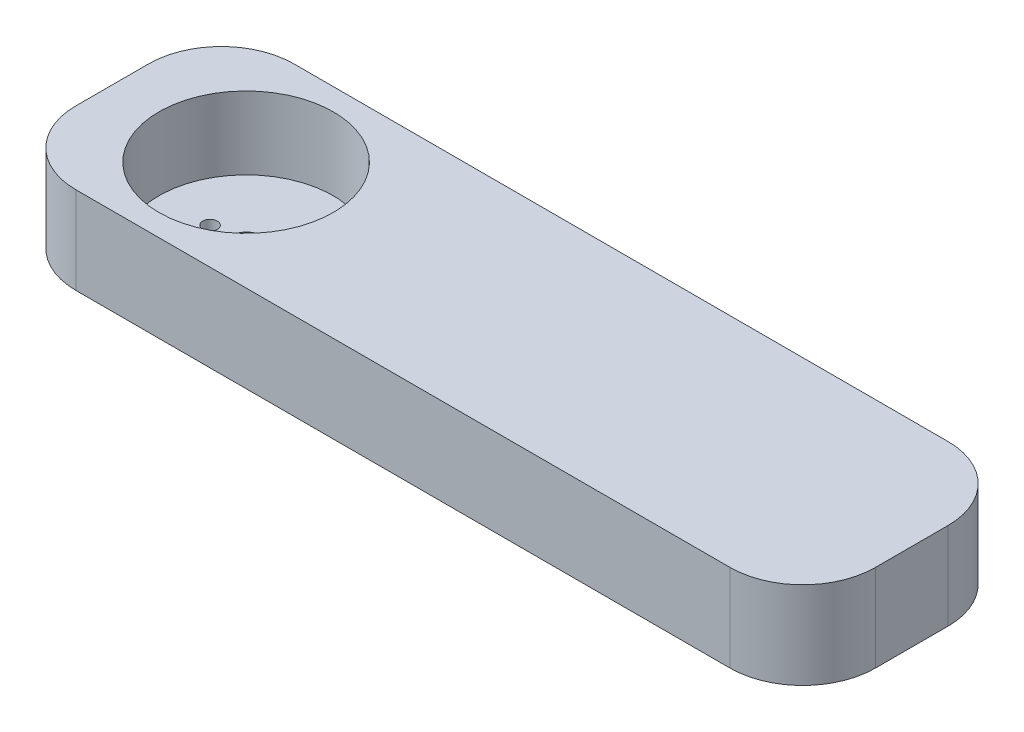
ISO-10303-21;
HEADER;
FILE_DESCRIPTION(('STEP AP214'),'2;1');
FILE_NAME('part.step','',(''),(''),'','','');
FILE_SCHEMA(('AUTOMOTIVE_DESIGN { 1 0 10303 214 1 1 1 1 }'));
ENDSEC;
DATA;
#1=APPLICATION_CONTEXT('core data for automotive mechanical design processes');
#2=APPLICATION_PROTOCOL_DEFINITION('international standard','automotive_design',2000,#1);
#3=PRODUCT_CONTEXT('',#1,'mechanical');
#4=PRODUCT('Part','Part','',(#3));
#5=PRODUCT_RELATED_PRODUCT_CATEGORY('part','',(#4));
#6=PRODUCT_DEFINITION_FORMATION('','',#4);
#7=PRODUCT_DEFINITION_CONTEXT('part definition',#1,'design');
#8=PRODUCT_DEFINITION('design','',#6,#7);
#9=PRODUCT_DEFINITION_SHAPE('','',#8);
#10=(LENGTH_UNIT() NAMED_UNIT(*) SI_UNIT(.MILLI.,.METRE.));
#11=(NAMED_UNIT(*) PLANE_ANGLE_UNIT() SI_UNIT($,.RADIAN.));
#12=(NAMED_UNIT(*) SI_UNIT($,.STERADIAN.) SOLID_ANGLE_UNIT());
#13=UNCERTAINTY_MEASURE_WITH_UNIT(LENGTH_MEASURE(1.E-05),#10,'distance_accuracy_value','');
#14=(GEOMETRIC_REPRESENTATION_CONTEXT(3) GLOBAL_UNCERTAINTY_ASSIGNED_CONTEXT((#13)) GLOBAL_UNIT_ASSIGNED_CONTEXT((#10,
#11,#12)) REPRESENTATION_CONTEXT('',''));
#15=CARTESIAN_POINT('',(0.,0.,0.));
#16=DIRECTION('',(0.,0.,1.));
#17=DIRECTION('',(1.,0.,0.));
#18=AXIS2_PLACEMENT_3D('',#15,#16,#17);
#19=CARTESIAN_POINT('',(-49.6145692439427,12.,-18.5383745295534));
#20=DIRECTION('',(1.,0.,0.));
#21=DIRECTION('',(0.,0.,-1.));
#22=AXIS2_PLACEMENT_3D('',#19,#20,#21);
#23=PLANE('',#22);
#24=DIRECTION('',(0.,0.,1.));
#25=VECTOR('',#24,1.);
#26=CARTESIAN_POINT('',(-49.6145692439427,12.,-18.5383745295534));
#27=LINE('',#26,#25);
#28=CARTESIAN_POINT('',(-49.6145692439427,12.,-8.53837452955342));
#29=VERTEX_POINT('',#28);
#30=CARTESIAN_POINT('',(-49.6145692439427,12.,1.46162547044658));
#31=VERTEX_POINT('',#30);
#32=EDGE_CURVE('E119',#29,#31,#27,.T.);
#33=ORIENTED_EDGE('',*,*,#32,.F.);
#34=DIRECTION('',(0.,-1.,0.));
#35=VECTOR('',#34,1.);
#36=CARTESIAN_POINT('',(-49.6145692439427,12.,-8.53837452955342));
#37=LINE('',#36,#35);
#38=CARTESIAN_POINT('',(-49.6145692439427,0.,-8.53837452955342));
#39=VERTEX_POINT('',#38);
#40=EDGE_CURVE('E105',#29,#39,#37,.T.);
#41=ORIENTED_EDGE('',*,*,#40,.T.);
#42=DIRECTION('',(0.,0.,1.));
#43=VECTOR('',#42,1.);
#44=CARTESIAN_POINT('',(-49.6145692439427,0.,-18.5383745295534));
#45=LINE('',#44,#43);
#46=CARTESIAN_POINT('',(-49.6145692439427,0.,1.46162547044658));
#47=VERTEX_POINT('',#46);
#48=EDGE_CURVE('E116',#39,#47,#45,.T.);
#49=ORIENTED_EDGE('',*,*,#48,.T.);
#50=DIRECTION('',(0.,-1.,0.));
#51=VECTOR('',#50,1.);
#52=CARTESIAN_POINT('',(-49.6145692439427,12.,1.46162547044658));
#53=LINE('',#52,#51);
#54=EDGE_CURVE('E120',#47,#31,#53,.F.);
#55=ORIENTED_EDGE('',*,*,#54,.T.);
#56=EDGE_LOOP('',(#33,#41,#49,#55));
#57=FACE_BOUND('',#56,.T.);
#58=ADVANCED_FACE('F33',(#57),#23,.F.);
#59=CARTESIAN_POINT('',(-49.6145692439427,12.,11.4616254704466));
#60=DIRECTION('',(0.,0.,-1.));
#61=DIRECTION('',(-1.,0.,0.));
#62=AXIS2_PLACEMENT_3D('',#59,#60,#61);
#63=PLANE('',#62);
#64=DIRECTION('',(1.,0.,0.));
#65=VECTOR('',#64,1.);
#66=CARTESIAN_POINT('',(-49.6145692439427,0.,11.4616254704466));
#67=LINE('',#66,#65);
#68=CARTESIAN_POINT('',(-39.6145692439427,0.,11.4616254704466));
#69=VERTEX_POINT('',#68);
#70=CARTESIAN_POINT('',(50.3854307560573,0.,11.4616254704466));
#71=VERTEX_POINT('',#70);
#72=EDGE_CURVE('E124',#69,#71,#67,.T.);
#73=ORIENTED_EDGE('',*,*,#72,.T.);
#74=DIRECTION('',(0.,-1.,0.));
#75=VECTOR('',#74,1.);
#76=CARTESIAN_POINT('',(50.3854307560573,12.,11.4616254704466));
#77=LINE('',#76,#75);
#78=CARTESIAN_POINT('',(50.3854307560573,12.,11.4616254704466));
#79=VERTEX_POINT('',#78);
#80=EDGE_CURVE('E11',#71,#79,#77,.F.);
#81=ORIENTED_EDGE('',*,*,#80,.T.);
#82=DIRECTION('',(1.,0.,0.));
#83=VECTOR('',#82,1.);
#84=CARTESIAN_POINT('',(-49.6145692439427,12.,11.4616254704466));
#85=LINE('',#84,#83);
#86=CARTESIAN_POINT('',(-39.6145692439427,12.,11.4616254704466));
#87=VERTEX_POINT('',#86);
#88=EDGE_CURVE('E178',#87,#79,#85,.T.);
#89=ORIENTED_EDGE('',*,*,#88,.F.);
#90=DIRECTION('',(0.,-1.,0.));
#91=VECTOR('',#90,1.);
#92=CARTESIAN_POINT('',(-39.6145692439427,12.,11.4616254704466));
#93=LINE('',#92,#91);
#94=EDGE_CURVE('E146',#87,#69,#93,.T.);
#95=ORIENTED_EDGE('',*,*,#94,.T.);
#96=EDGE_LOOP('',(#73,#81,#89,#95));
#97=FACE_BOUND('',#96,.T.);
#98=ADVANCED_FACE('F176',(#97),#63,.F.);
#99=CARTESIAN_POINT('',(60.3854307560573,12.,-18.5383745295534));
#100=DIRECTION('',(-1.,0.,0.));
#101=DIRECTION('',(0.,0.,1.));
#102=AXIS2_PLACEMENT_3D('',#99,#100,#101);
#103=PLANE('',#102);
#104=DIRECTION('',(0.,0.,-1.));
#105=VECTOR('',#104,1.);
#106=CARTESIAN_POINT('',(60.3854307560573,0.,-18.5383745295534));
#107=LINE('',#106,#105);
#108=CARTESIAN_POINT('',(60.3854307560573,0.,1.46162547044659));
#109=VERTEX_POINT('',#108);
#110=CARTESIAN_POINT('',(60.3854307560573,0.,-8.53837452955341));
#111=VERTEX_POINT('',#110);
#112=EDGE_CURVE('E127',#109,#111,#107,.T.);
#113=ORIENTED_EDGE('',*,*,#112,.T.);
#114=DIRECTION('',(0.,-1.,0.));
#115=VECTOR('',#114,1.);
#116=CARTESIAN_POINT('',(60.3854307560573,12.,-8.53837452955341));
#117=LINE('',#116,#115);
#118=CARTESIAN_POINT('',(60.3854307560573,12.,-8.53837452955341));
#119=VERTEX_POINT('',#118);
#120=EDGE_CURVE('E54',#111,#119,#117,.F.);
#121=ORIENTED_EDGE('',*,*,#120,.T.);
#122=DIRECTION('',(0.,0.,-1.));
#123=VECTOR('',#122,1.);
#124=CARTESIAN_POINT('',(60.3854307560573,12.,-18.5383745295534));
#125=LINE('',#124,#123);
#126=CARTESIAN_POINT('',(60.3854307560573,12.,1.46162547044659));
#127=VERTEX_POINT('',#126);
#128=EDGE_CURVE('E165',#127,#119,#125,.T.);
#129=ORIENTED_EDGE('',*,*,#128,.F.);
#130=DIRECTION('',(0.,-1.,0.));
#131=VECTOR('',#130,1.);
#132=CARTESIAN_POINT('',(60.3854307560573,12.,1.46162547044659));
#133=LINE('',#132,#131);
#134=EDGE_CURVE('E156',#127,#109,#133,.T.);
#135=ORIENTED_EDGE('',*,*,#134,.T.);
#136=EDGE_LOOP('',(#113,#121,#129,#135));
#137=FACE_BOUND('',#136,.T.);
#138=ADVANCED_FACE('F172',(#137),#103,.F.);
#139=CARTESIAN_POINT('',(-49.6145692439427,12.,-18.5383745295534));
#140=DIRECTION('',(0.,0.,1.));
#141=DIRECTION('',(1.,0.,0.));
#142=AXIS2_PLACEMENT_3D('',#139,#140,#141);
#143=PLANE('',#142);
#144=DIRECTION('',(-1.,0.,0.));
#145=VECTOR('',#144,1.);
#146=CARTESIAN_POINT('',(-49.6145692439427,12.,-18.5383745295534));
#147=LINE('',#146,#145);
#148=CARTESIAN_POINT('',(50.3854307560573,12.,-18.5383745295534));
#149=VERTEX_POINT('',#148);
#150=CARTESIAN_POINT('',(-39.6145692439427,12.,-18.5383745295534));
#151=VERTEX_POINT('',#150);
#152=EDGE_CURVE('E133',#149,#151,#147,.T.);
#153=ORIENTED_EDGE('',*,*,#152,.F.);
#154=DIRECTION('',(0.,-1.,0.));
#155=VECTOR('',#154,1.);
#156=CARTESIAN_POINT('',(50.3854307560573,12.,-18.5383745295534));
#157=LINE('',#156,#155);
#158=CARTESIAN_POINT('',(50.3854307560573,0.,-18.5383745295534));
#159=VERTEX_POINT('',#158);
#160=EDGE_CURVE('E149',#149,#159,#157,.T.);
#161=ORIENTED_EDGE('',*,*,#160,.T.);
#162=DIRECTION('',(-1.,0.,0.));
#163=VECTOR('',#162,1.);
#164=CARTESIAN_POINT('',(-49.6145692439427,0.,-18.5383745295534));
#165=LINE('',#164,#163);
#166=CARTESIAN_POINT('',(-39.6145692439427,0.,-18.5383745295534));
#167=VERTEX_POINT('',#166);
#168=EDGE_CURVE('E137',#159,#167,#165,.T.);
#169=ORIENTED_EDGE('',*,*,#168,.T.);
#170=DIRECTION('',(0.,-1.,0.));
#171=VECTOR('',#170,1.);
#172=CARTESIAN_POINT('',(-39.6145692439427,12.,-18.5383745295534));
#173=LINE('',#172,#171);
#174=EDGE_CURVE('E107',#167,#151,#173,.F.);
#175=ORIENTED_EDGE('',*,*,#174,.T.);
#176=EDGE_LOOP('',(#153,#161,#169,#175));
#177=FACE_BOUND('',#176,.T.);
#178=ADVANCED_FACE('F169',(#177),#143,.F.);
#179=CARTESIAN_POINT('',(0.,12.,0.));
#180=DIRECTION('',(0.,1.,0.));
#181=DIRECTION('',(0.,0.,1.));
#182=AXIS2_PLACEMENT_3D('',#179,#180,#181);
#183=PLANE('',#182);
#184=CARTESIAN_POINT('',(-31.1957624230947,12.,-3.53837452955342));
#185=DIRECTION('',(0.,1.,0.));
#186=DIRECTION('',(0.,0.,1.));
#187=AXIS2_PLACEMENT_3D('',#184,#185,#186);
#188=CIRCLE('',#187,12.);
#189=CARTESIAN_POINT('',(-31.1957624230947,12.,8.46162547044659));
#190=VERTEX_POINT('',#189);
#191=EDGE_CURVE('E130',#190,#190,#188,.T.);
#192=ORIENTED_EDGE('',*,*,#191,.F.);
#193=EDGE_LOOP('',(#192));
#194=FACE_BOUND('',#193,.T.);
#195=ORIENTED_EDGE('',*,*,#128,.T.);
#196=CARTESIAN_POINT('',(50.3854307560573,12.,-8.53837452955342));
#197=DIRECTION('',(0.,1.,0.));
#198=DIRECTION('',(0.,0.,1.));
#199=AXIS2_PLACEMENT_3D('',#196,#197,#198);
#200=CIRCLE('',#199,10.);
#201=EDGE_CURVE('E41',#119,#149,#200,.T.);
#202=ORIENTED_EDGE('',*,*,#201,.T.);
#203=ORIENTED_EDGE('',*,*,#152,.T.);
#204=CARTESIAN_POINT('',(-39.6145692439427,12.,-8.53837452955342));
#205=DIRECTION('',(0.,1.,0.));
#206=DIRECTION('',(0.,0.,1.));
#207=AXIS2_PLACEMENT_3D('',#204,#205,#206);
#208=CIRCLE('',#207,10.);
#209=EDGE_CURVE('E144',#151,#29,#208,.T.);
#210=ORIENTED_EDGE('',*,*,#209,.T.);
#211=ORIENTED_EDGE('',*,*,#32,.T.);
#212=CARTESIAN_POINT('',(-39.6145692439427,12.,1.46162547044658));
#213=DIRECTION('',(0.,1.,0.));
#214=DIRECTION('',(0.,0.,1.));
#215=AXIS2_PLACEMENT_3D('',#212,#213,#214);
#216=CIRCLE('',#215,10.);
#217=EDGE_CURVE('E142',#31,#87,#216,.T.);
#218=ORIENTED_EDGE('',*,*,#217,.T.);
#219=ORIENTED_EDGE('',*,*,#88,.T.);
#220=CARTESIAN_POINT('',(50.3854307560573,12.,1.46162547044659));
#221=DIRECTION('',(0.,1.,0.));
#222=DIRECTION('',(0.,0.,1.));
#223=AXIS2_PLACEMENT_3D('',#220,#221,#222);
#224=CIRCLE('',#223,10.);
#225=EDGE_CURVE('E160',#79,#127,#224,.T.);
#226=ORIENTED_EDGE('',*,*,#225,.T.);
#227=EDGE_LOOP('',(#195,#202,#203,#210,#211,#218,#219,#226));
#228=FACE_BOUND('',#227,.T.);
#229=ADVANCED_FACE('F164',(#194,#228),#183,.T.);
#230=CARTESIAN_POINT('',(0.,0.,0.));
#231=DIRECTION('',(0.,1.,0.));
#232=DIRECTION('',(0.,0.,1.));
#233=AXIS2_PLACEMENT_3D('',#230,#231,#232);
#234=PLANE('',#233);
#235=CARTESIAN_POINT('',(-36.1635501370406,0.,-3.53837452955341));
#236=DIRECTION('',(0.,1.,0.));
#237=DIRECTION('',(0.,0.,-1.));
#238=AXIS2_PLACEMENT_3D('',#235,#236,#237);
#239=CIRCLE('',#238,0.999999999999998);
#240=CARTESIAN_POINT('',(-36.1635501370406,0.,-4.53837452955341));
#241=VERTEX_POINT('',#240);
#242=EDGE_CURVE('E197',#241,#241,#239,.T.);
#243=ORIENTED_EDGE('',*,*,#242,.T.);
#244=EDGE_LOOP('',(#243));
#245=FACE_BOUND('',#244,.T.);
#246=CARTESIAN_POINT('',(-26.1317928261841,0.,-3.53837452955341));
#247=DIRECTION('',(0.,1.,0.));
#248=DIRECTION('',(0.,0.,1.));
#249=AXIS2_PLACEMENT_3D('',#246,#247,#248);
#250=CIRCLE('',#249,0.999999999999998);
#251=CARTESIAN_POINT('',(-26.1317928261841,0.,-2.53837452955341));
#252=VERTEX_POINT('',#251);
#253=EDGE_CURVE('E191',#252,#252,#250,.T.);
#254=ORIENTED_EDGE('',*,*,#253,.T.);
#255=EDGE_LOOP('',(#254));
#256=FACE_BOUND('',#255,.T.);
#257=CARTESIAN_POINT('',(-31.1476714816123,0.,-3.53837452955341));
#258=DIRECTION('',(0.,1.,0.));
#259=DIRECTION('',(0.,0.,1.));
#260=AXIS2_PLACEMENT_3D('',#257,#258,#259);
#261=CIRCLE('',#260,2.4);
#262=CARTESIAN_POINT('',(-31.1476714816123,0.,-1.13837452955341));
#263=VERTEX_POINT('',#262);
#264=EDGE_CURVE('E186',#263,#263,#261,.T.);
#265=ORIENTED_EDGE('',*,*,#264,.T.);
#266=EDGE_LOOP('',(#265));
#267=FACE_BOUND('',#266,.T.);
#268=ORIENTED_EDGE('',*,*,#168,.F.);
#269=CARTESIAN_POINT('',(50.3854307560573,0.,-8.53837452955342));
#270=DIRECTION('',(0.,1.,0.));
#271=DIRECTION('',(0.,0.,1.));
#272=AXIS2_PLACEMENT_3D('',#269,#270,#271);
#273=CIRCLE('',#272,10.);
#274=EDGE_CURVE('E154',#159,#111,#273,.F.);
#275=ORIENTED_EDGE('',*,*,#274,.T.);
#276=ORIENTED_EDGE('',*,*,#112,.F.);
#277=CARTESIAN_POINT('',(50.3854307560573,0.,1.46162547044659));
#278=DIRECTION('',(0.,1.,0.));
#279=DIRECTION('',(0.,0.,1.));
#280=AXIS2_PLACEMENT_3D('',#277,#278,#279);
#281=CIRCLE('',#280,10.);
#282=EDGE_CURVE('E152',#109,#71,#281,.F.);
#283=ORIENTED_EDGE('',*,*,#282,.T.);
#284=ORIENTED_EDGE('',*,*,#72,.F.);
#285=CARTESIAN_POINT('',(-39.6145692439427,0.,1.46162547044658));
#286=DIRECTION('',(0.,1.,0.));
#287=DIRECTION('',(0.,0.,1.));
#288=AXIS2_PLACEMENT_3D('',#285,#286,#287);
#289=CIRCLE('',#288,10.);
#290=EDGE_CURVE('E111',#69,#47,#289,.F.);
#291=ORIENTED_EDGE('',*,*,#290,.T.);
#292=ORIENTED_EDGE('',*,*,#48,.F.);
#293=CARTESIAN_POINT('',(-39.6145692439427,0.,-8.53837452955342));
#294=DIRECTION('',(0.,1.,0.));
#295=DIRECTION('',(0.,0.,1.));
#296=AXIS2_PLACEMENT_3D('',#293,#294,#295);
#297=CIRCLE('',#296,10.);
#298=EDGE_CURVE('E101',#39,#167,#297,.F.);
#299=ORIENTED_EDGE('',*,*,#298,.T.);
#300=EDGE_LOOP('',(#268,#275,#276,#283,#284,#291,#292,#299));
#301=FACE_BOUND('',#300,.T.);
#302=ADVANCED_FACE('F122',(#245,#256,#267,#301),#234,.F.);
#303=CARTESIAN_POINT('',(-39.6145692439427,12.,-8.53837452955342));
#304=DIRECTION('',(0.,-1.,0.));
#305=DIRECTION('',(0.,0.,-1.));
#306=AXIS2_PLACEMENT_3D('',#303,#304,#305);
#307=CYLINDRICAL_SURFACE('',#306,10.);
#308=ORIENTED_EDGE('',*,*,#209,.F.);
#309=ORIENTED_EDGE('',*,*,#174,.F.);
#310=ORIENTED_EDGE('',*,*,#298,.F.);
#311=ORIENTED_EDGE('',*,*,#40,.F.);
#312=EDGE_LOOP('',(#308,#309,#310,#311));
#313=FACE_BOUND('',#312,.T.);
#314=ADVANCED_FACE('F104',(#313),#307,.T.);
#315=CARTESIAN_POINT('',(-39.6145692439427,12.,1.46162547044658));
#316=DIRECTION('',(0.,-1.,0.));
#317=DIRECTION('',(0.,0.,-1.));
#318=AXIS2_PLACEMENT_3D('',#315,#316,#317);
#319=CYLINDRICAL_SURFACE('',#318,10.);
#320=ORIENTED_EDGE('',*,*,#217,.F.);
#321=ORIENTED_EDGE('',*,*,#54,.F.);
#322=ORIENTED_EDGE('',*,*,#290,.F.);
#323=ORIENTED_EDGE('',*,*,#94,.F.);
#324=EDGE_LOOP('',(#320,#321,#322,#323));
#325=FACE_BOUND('',#324,.T.);
#326=ADVANCED_FACE('F181',(#325),#319,.T.);
#327=CARTESIAN_POINT('',(50.3854307560573,12.,-8.53837452955342));
#328=DIRECTION('',(0.,-1.,0.));
#329=DIRECTION('',(0.,0.,-1.));
#330=AXIS2_PLACEMENT_3D('',#327,#328,#329);
#331=CYLINDRICAL_SURFACE('',#330,10.);
#332=ORIENTED_EDGE('',*,*,#201,.F.);
#333=ORIENTED_EDGE('',*,*,#120,.F.);
#334=ORIENTED_EDGE('',*,*,#274,.F.);
#335=ORIENTED_EDGE('',*,*,#160,.F.);
#336=EDGE_LOOP('',(#332,#333,#334,#335));
#337=FACE_BOUND('',#336,.T.);
#338=ADVANCED_FACE('F170',(#337),#331,.T.);
#339=CARTESIAN_POINT('',(50.3854307560573,12.,1.46162547044659));
#340=DIRECTION('',(0.,-1.,0.));
#341=DIRECTION('',(0.,0.,-1.));
#342=AXIS2_PLACEMENT_3D('',#339,#340,#341);
#343=CYLINDRICAL_SURFACE('',#342,10.);
#344=ORIENTED_EDGE('',*,*,#225,.F.);
#345=ORIENTED_EDGE('',*,*,#80,.F.);
#346=ORIENTED_EDGE('',*,*,#282,.F.);
#347=ORIENTED_EDGE('',*,*,#134,.F.);
#348=EDGE_LOOP('',(#344,#345,#346,#347));
#349=FACE_BOUND('',#348,.T.);
#350=ADVANCED_FACE('F35',(#349),#343,.T.);
#351=CARTESIAN_POINT('',(-31.1957624230947,2.,-3.53837452955342));
#352=DIRECTION('',(0.,1.,0.));
#353=DIRECTION('',(0.,0.,1.));
#354=AXIS2_PLACEMENT_3D('',#351,#352,#353);
#355=CYLINDRICAL_SURFACE('',#354,12.);
#356=CARTESIAN_POINT('',(-31.1957624230947,2.,-3.53837452955342));
#357=DIRECTION('',(0.,1.,0.));
#358=DIRECTION('',(0.,0.,1.));
#359=AXIS2_PLACEMENT_3D('',#356,#357,#358);
#360=CIRCLE('',#359,12.);
#361=CARTESIAN_POINT('',(-31.1957624230947,2.,8.46162547044659));
#362=VERTEX_POINT('',#361);
#363=EDGE_CURVE('E125',#362,#362,#360,.T.);
#364=ORIENTED_EDGE('',*,*,#363,.F.);
#365=EDGE_LOOP('',(#364));
#366=FACE_BOUND('',#365,.T.);
#367=ORIENTED_EDGE('',*,*,#191,.T.);
#368=EDGE_LOOP('',(#367));
#369=FACE_BOUND('',#368,.T.);
#370=ADVANCED_FACE('F218',(#366,#369),#355,.F.);
#371=CARTESIAN_POINT('',(-31.1957624230947,2.,-3.53837452955342));
#372=DIRECTION('',(0.,1.,0.));
#373=DIRECTION('',(0.,0.,1.));
#374=AXIS2_PLACEMENT_3D('',#371,#372,#373);
#375=PLANE('',#374);
#376=CARTESIAN_POINT('',(-31.1476714816123,2.,-3.53837452955341));
#377=DIRECTION('',(0.,1.,0.));
#378=DIRECTION('',(0.,0.,1.));
#379=AXIS2_PLACEMENT_3D('',#376,#377,#378);
#380=CIRCLE('',#379,2.4);
#381=CARTESIAN_POINT('',(-31.1476714816123,2.,-1.13837452955341));
#382=VERTEX_POINT('',#381);
#383=EDGE_CURVE('E188',#382,#382,#380,.T.);
#384=ORIENTED_EDGE('',*,*,#383,.F.);
#385=EDGE_LOOP('',(#384));
#386=FACE_BOUND('',#385,.T.);
#387=CARTESIAN_POINT('',(-36.1635501370406,2.,-3.53837452955341));
#388=DIRECTION('',(0.,1.,0.));
#389=DIRECTION('',(0.,0.,-1.));
#390=AXIS2_PLACEMENT_3D('',#387,#388,#389);
#391=CIRCLE('',#390,0.999999999999998);
#392=CARTESIAN_POINT('',(-36.1635501370406,2.,-4.53837452955341));
#393=VERTEX_POINT('',#392);
#394=EDGE_CURVE('E194',#393,#393,#391,.T.);
#395=ORIENTED_EDGE('',*,*,#394,.F.);
#396=EDGE_LOOP('',(#395));
#397=FACE_BOUND('',#396,.T.);
#398=CARTESIAN_POINT('',(-26.1317928261841,2.,-3.53837452955341));
#399=DIRECTION('',(0.,1.,0.));
#400=DIRECTION('',(0.,0.,1.));
#401=AXIS2_PLACEMENT_3D('',#398,#399,#400);
#402=CIRCLE('',#401,0.999999999999998);
#403=CARTESIAN_POINT('',(-26.1317928261841,2.,-2.53837452955341));
#404=VERTEX_POINT('',#403);
#405=EDGE_CURVE('E200',#404,#404,#402,.T.);
#406=ORIENTED_EDGE('',*,*,#405,.F.);
#407=EDGE_LOOP('',(#406));
#408=FACE_BOUND('',#407,.T.);
#409=ORIENTED_EDGE('',*,*,#363,.T.);
#410=EDGE_LOOP('',(#409));
#411=FACE_BOUND('',#410,.T.);
#412=ADVANCED_FACE('F212',(#386,#397,#408,#411),#375,.T.);
#413=CARTESIAN_POINT('',(-26.1317928261841,0.,-3.53837452955341));
#414=DIRECTION('',(0.,1.,0.));
#415=DIRECTION('',(0.,0.,1.));
#416=AXIS2_PLACEMENT_3D('',#413,#414,#415);
#417=CYLINDRICAL_SURFACE('',#416,0.999999999999998);
#418=ORIENTED_EDGE('',*,*,#253,.F.);
#419=EDGE_LOOP('',(#418));
#420=FACE_BOUND('',#419,.T.);
#421=ORIENTED_EDGE('',*,*,#405,.T.);
#422=EDGE_LOOP('',(#421));
#423=FACE_BOUND('',#422,.T.);
#424=ADVANCED_FACE('F208',(#420,#423),#417,.F.);
#425=CARTESIAN_POINT('',(-36.1635501370406,0.,-3.53837452955341));
#426=DIRECTION('',(0.,1.,0.));
#427=DIRECTION('',(0.,0.,1.));
#428=AXIS2_PLACEMENT_3D('',#425,#426,#427);
#429=CYLINDRICAL_SURFACE('',#428,0.999999999999998);
#430=ORIENTED_EDGE('',*,*,#242,.F.);
#431=EDGE_LOOP('',(#430));
#432=FACE_BOUND('',#431,.T.);
#433=ORIENTED_EDGE('',*,*,#394,.T.);
#434=EDGE_LOOP('',(#433));
#435=FACE_BOUND('',#434,.T.);
#436=ADVANCED_FACE('F211',(#432,#435),#429,.F.);
#437=CARTESIAN_POINT('',(-31.1476714816123,0.,-3.53837452955341));
#438=DIRECTION('',(0.,1.,0.));
#439=DIRECTION('',(0.,0.,1.));
#440=AXIS2_PLACEMENT_3D('',#437,#438,#439);
#441=CYLINDRICAL_SURFACE('',#440,2.4);
#442=ORIENTED_EDGE('',*,*,#264,.F.);
#443=EDGE_LOOP('',(#442));
#444=FACE_BOUND('',#443,.T.);
#445=ORIENTED_EDGE('',*,*,#383,.T.);
#446=EDGE_LOOP('',(#445));
#447=FACE_BOUND('',#446,.T.);
#448=ADVANCED_FACE('F273',(#444,#447),#441,.F.);
#449=CLOSED_SHELL('',(#58,#98,#138,#178,#229,#302,#314,#326,#338,#350,#370,#412,#424,#436,#448));
#450=MANIFOLD_SOLID_BREP('B2',#449);
#451=ADVANCED_BREP_SHAPE_REPRESENTATION('',(#18,#450),#14);
#452=SHAPE_DEFINITION_REPRESENTATION(#9,#451);
ENDSEC;
END-ISO-10303-21;
